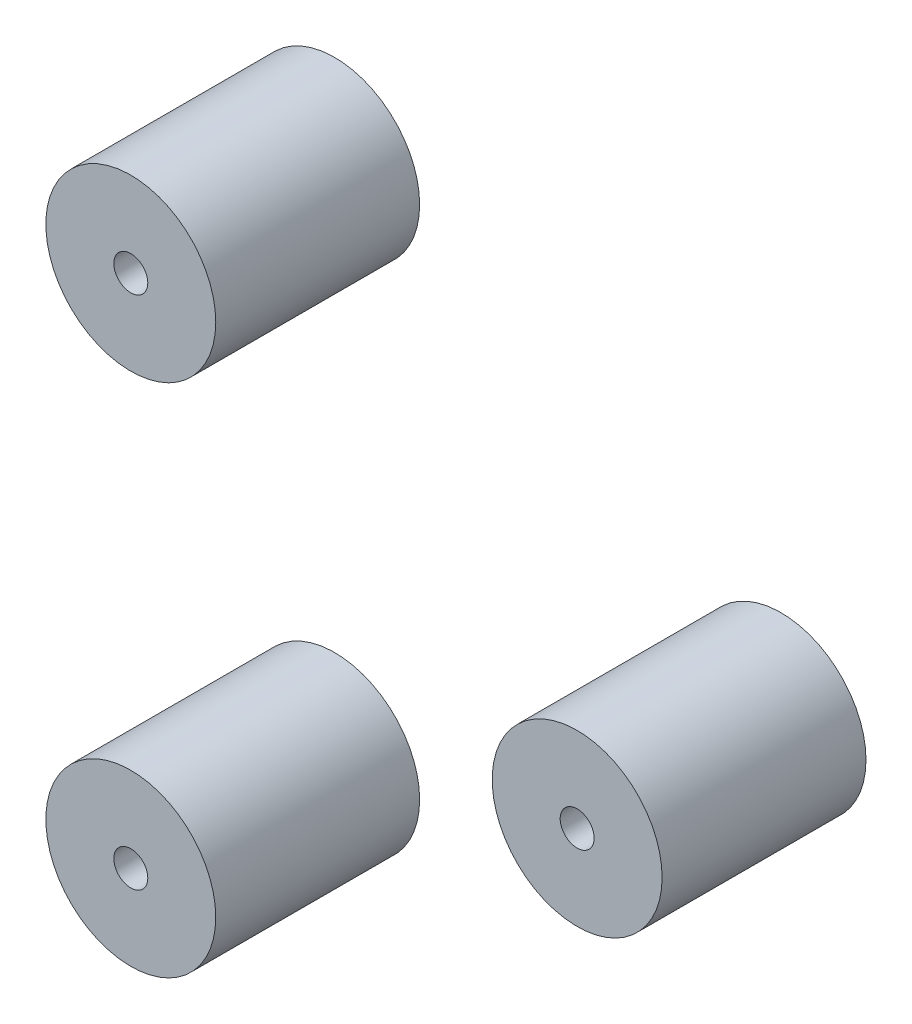
ISO-10303-21;
HEADER;
FILE_DESCRIPTION(('STEP AP214'),'2;1');
FILE_NAME('part.step','',(''),(''),'','','');
FILE_SCHEMA(('AUTOMOTIVE_DESIGN { 1 0 10303 214 1 1 1 1 }'));
ENDSEC;
DATA;
#1=APPLICATION_CONTEXT('core data for automotive mechanical design processes');
#2=APPLICATION_PROTOCOL_DEFINITION('international standard','automotive_design',2000,#1);
#3=PRODUCT_CONTEXT('',#1,'mechanical');
#4=PRODUCT('Part','Part','',(#3));
#5=PRODUCT_RELATED_PRODUCT_CATEGORY('part','',(#4));
#6=PRODUCT_DEFINITION_FORMATION('','',#4);
#7=PRODUCT_DEFINITION_CONTEXT('part definition',#1,'design');
#8=PRODUCT_DEFINITION('design','',#6,#7);
#9=PRODUCT_DEFINITION_SHAPE('','',#8);
#10=(LENGTH_UNIT() NAMED_UNIT(*) SI_UNIT(.MILLI.,.METRE.));
#11=(NAMED_UNIT(*) PLANE_ANGLE_UNIT() SI_UNIT($,.RADIAN.));
#12=(NAMED_UNIT(*) SI_UNIT($,.STERADIAN.) SOLID_ANGLE_UNIT());
#13=UNCERTAINTY_MEASURE_WITH_UNIT(LENGTH_MEASURE(1.E-05),#10,'distance_accuracy_value','');
#14=(GEOMETRIC_REPRESENTATION_CONTEXT(3) GLOBAL_UNCERTAINTY_ASSIGNED_CONTEXT((#13)) GLOBAL_UNIT_ASSIGNED_CONTEXT((#10,
#11,#12)) REPRESENTATION_CONTEXT('',''));
#15=CARTESIAN_POINT('',(0.,0.,0.));
#16=DIRECTION('',(0.,0.,1.));
#17=DIRECTION('',(1.,0.,0.));
#18=AXIS2_PLACEMENT_3D('',#15,#16,#17);
#19=CARTESIAN_POINT('',(-21.8925184366595,37.9189542379334,30.));
#20=DIRECTION('',(0.,0.,-1.));
#21=DIRECTION('',(-1.,0.,0.));
#22=AXIS2_PLACEMENT_3D('',#19,#20,#21);
#23=CYLINDRICAL_SURFACE('',#22,2.5);
#24=CARTESIAN_POINT('',(-21.8925184366595,37.9189542379334,30.));
#25=DIRECTION('',(0.,0.,1.));
#26=DIRECTION('',(1.,0.,0.));
#27=AXIS2_PLACEMENT_3D('',#24,#25,#26);
#28=CIRCLE('',#27,2.5);
#29=CARTESIAN_POINT('',(-19.3925184366595,37.9189542379334,30.));
#30=VERTEX_POINT('',#29);
#31=EDGE_CURVE('E53',#30,#30,#28,.T.);
#32=ORIENTED_EDGE('',*,*,#31,.T.);
#33=EDGE_LOOP('',(#32));
#34=FACE_BOUND('',#33,.T.);
#35=CARTESIAN_POINT('',(-21.8925184366595,37.9189542379334,25.));
#36=DIRECTION('',(0.,0.,-1.));
#37=DIRECTION('',(-1.,0.,0.));
#38=AXIS2_PLACEMENT_3D('',#35,#36,#37);
#39=CIRCLE('',#38,2.5);
#40=CARTESIAN_POINT('',(-24.3925184366595,37.9189542379334,25.));
#41=VERTEX_POINT('',#40);
#42=EDGE_CURVE('E44',#41,#41,#39,.T.);
#43=ORIENTED_EDGE('',*,*,#42,.T.);
#44=EDGE_LOOP('',(#43));
#45=FACE_BOUND('',#44,.T.);
#46=ADVANCED_FACE('F40',(#34,#45),#23,.F.);
#47=CARTESIAN_POINT('',(-21.8925184366595,37.9189542379334,30.));
#48=DIRECTION('',(0.,0.,1.));
#49=DIRECTION('',(1.,0.,0.));
#50=AXIS2_PLACEMENT_3D('',#47,#48,#49);
#51=PLANE('',#50);
#52=CARTESIAN_POINT('',(-21.8925184366595,37.9189542379334,30.));
#53=DIRECTION('',(0.,0.,1.));
#54=DIRECTION('',(1.,0.,0.));
#55=AXIS2_PLACEMENT_3D('',#52,#53,#54);
#56=CIRCLE('',#55,12.5);
#57=CARTESIAN_POINT('',(-9.39251843665948,37.9189542379334,30.));
#58=VERTEX_POINT('',#57);
#59=EDGE_CURVE('E11',#58,#58,#56,.T.);
#60=ORIENTED_EDGE('',*,*,#59,.T.);
#61=EDGE_LOOP('',(#60));
#62=FACE_BOUND('',#61,.T.);
#63=ORIENTED_EDGE('',*,*,#31,.F.);
#64=EDGE_LOOP('',(#63));
#65=FACE_BOUND('',#64,.T.);
#66=ADVANCED_FACE('F78',(#62,#65),#51,.T.);
#67=CARTESIAN_POINT('',(-21.8925184366595,37.9189542379334,0.));
#68=DIRECTION('',(0.,0.,1.));
#69=DIRECTION('',(1.,0.,0.));
#70=AXIS2_PLACEMENT_3D('',#67,#68,#69);
#71=PLANE('',#70);
#72=CARTESIAN_POINT('',(-21.8925184366595,37.9189542379334,0.));
#73=DIRECTION('',(0.,0.,-1.));
#74=DIRECTION('',(-1.,0.,0.));
#75=AXIS2_PLACEMENT_3D('',#72,#73,#74);
#76=CIRCLE('',#75,8.);
#77=CARTESIAN_POINT('',(-29.8925184366595,37.9189542379334,0.));
#78=VERTEX_POINT('',#77);
#79=EDGE_CURVE('E57',#78,#78,#76,.T.);
#80=ORIENTED_EDGE('',*,*,#79,.F.);
#81=EDGE_LOOP('',(#80));
#82=FACE_BOUND('',#81,.T.);
#83=CARTESIAN_POINT('',(-21.8925184366595,37.9189542379334,0.));
#84=DIRECTION('',(0.,0.,1.));
#85=DIRECTION('',(1.,0.,0.));
#86=AXIS2_PLACEMENT_3D('',#83,#84,#85);
#87=CIRCLE('',#86,12.5);
#88=CARTESIAN_POINT('',(-9.39251843665948,37.9189542379334,0.));
#89=VERTEX_POINT('',#88);
#90=EDGE_CURVE('E48',#89,#89,#87,.T.);
#91=ORIENTED_EDGE('',*,*,#90,.F.);
#92=EDGE_LOOP('',(#91));
#93=FACE_BOUND('',#92,.T.);
#94=ADVANCED_FACE('F84',(#82,#93),#71,.F.);
#95=CARTESIAN_POINT('',(-21.8925184366595,37.9189542379334,30.));
#96=DIRECTION('',(0.,0.,-1.));
#97=DIRECTION('',(-1.,0.,0.));
#98=AXIS2_PLACEMENT_3D('',#95,#96,#97);
#99=CYLINDRICAL_SURFACE('',#98,12.5);
#100=ORIENTED_EDGE('',*,*,#59,.F.);
#101=EDGE_LOOP('',(#100));
#102=FACE_BOUND('',#101,.T.);
#103=ORIENTED_EDGE('',*,*,#90,.T.);
#104=EDGE_LOOP('',(#103));
#105=FACE_BOUND('',#104,.T.);
#106=ADVANCED_FACE('F42',(#102,#105),#99,.T.);
#107=CARTESIAN_POINT('',(-21.8925184366595,37.9189542379334,25.));
#108=DIRECTION('',(0.,0.,-1.));
#109=DIRECTION('',(-1.,0.,0.));
#110=AXIS2_PLACEMENT_3D('',#107,#108,#109);
#111=CYLINDRICAL_SURFACE('',#110,8.);
#112=CARTESIAN_POINT('',(-21.8925184366595,37.9189542379334,25.));
#113=DIRECTION('',(0.,0.,-1.));
#114=DIRECTION('',(-1.,0.,0.));
#115=AXIS2_PLACEMENT_3D('',#112,#113,#114);
#116=CIRCLE('',#115,8.);
#117=CARTESIAN_POINT('',(-29.8925184366595,37.9189542379334,25.));
#118=VERTEX_POINT('',#117);
#119=EDGE_CURVE('E60',#118,#118,#116,.T.);
#120=ORIENTED_EDGE('',*,*,#119,.F.);
#121=EDGE_LOOP('',(#120));
#122=FACE_BOUND('',#121,.T.);
#123=ORIENTED_EDGE('',*,*,#79,.T.);
#124=EDGE_LOOP('',(#123));
#125=FACE_BOUND('',#124,.T.);
#126=ADVANCED_FACE('F70',(#122,#125),#111,.F.);
#127=CARTESIAN_POINT('',(-21.8925184366595,37.9189542379334,25.));
#128=DIRECTION('',(0.,0.,-1.));
#129=DIRECTION('',(-1.,0.,0.));
#130=AXIS2_PLACEMENT_3D('',#127,#128,#129);
#131=PLANE('',#130);
#132=ORIENTED_EDGE('',*,*,#42,.F.);
#133=EDGE_LOOP('',(#132));
#134=FACE_BOUND('',#133,.T.);
#135=ORIENTED_EDGE('',*,*,#119,.T.);
#136=EDGE_LOOP('',(#135));
#137=FACE_BOUND('',#136,.T.);
#138=ADVANCED_FACE('F68',(#134,#137),#131,.T.);
#139=CLOSED_SHELL('',(#46,#66,#94,#106,#126,#138));
#140=MANIFOLD_SOLID_BREP('B2',#139);
#141=CARTESIAN_POINT('',(-21.89251843666,-37.9189542379331,30.));
#142=DIRECTION('',(0.,0.,-1.));
#143=DIRECTION('',(-1.,0.,0.));
#144=AXIS2_PLACEMENT_3D('',#141,#142,#143);
#145=CYLINDRICAL_SURFACE('',#144,2.5);
#146=CARTESIAN_POINT('',(-21.89251843666,-37.9189542379331,30.));
#147=DIRECTION('',(0.,0.,1.));
#148=DIRECTION('',(1.,0.,0.));
#149=AXIS2_PLACEMENT_3D('',#146,#147,#148);
#150=CIRCLE('',#149,2.5);
#151=CARTESIAN_POINT('',(-19.39251843666,-37.9189542379331,30.));
#152=VERTEX_POINT('',#151);
#153=EDGE_CURVE('E152',#152,#152,#150,.T.);
#154=ORIENTED_EDGE('',*,*,#153,.T.);
#155=EDGE_LOOP('',(#154));
#156=FACE_BOUND('',#155,.T.);
#157=CARTESIAN_POINT('',(-21.89251843666,-37.9189542379331,25.));
#158=DIRECTION('',(0.,0.,-1.));
#159=DIRECTION('',(-1.,0.,0.));
#160=AXIS2_PLACEMENT_3D('',#157,#158,#159);
#161=CIRCLE('',#160,2.5);
#162=CARTESIAN_POINT('',(-24.39251843666,-37.9189542379331,25.));
#163=VERTEX_POINT('',#162);
#164=EDGE_CURVE('E143',#163,#163,#161,.T.);
#165=ORIENTED_EDGE('',*,*,#164,.T.);
#166=EDGE_LOOP('',(#165));
#167=FACE_BOUND('',#166,.T.);
#168=ADVANCED_FACE('F139',(#156,#167),#145,.F.);
#169=CARTESIAN_POINT('',(-21.89251843666,-37.9189542379331,30.));
#170=DIRECTION('',(0.,0.,1.));
#171=DIRECTION('',(1.,0.,0.));
#172=AXIS2_PLACEMENT_3D('',#169,#170,#171);
#173=PLANE('',#172);
#174=CARTESIAN_POINT('',(-21.89251843666,-37.9189542379331,30.));
#175=DIRECTION('',(0.,0.,1.));
#176=DIRECTION('',(1.,0.,0.));
#177=AXIS2_PLACEMENT_3D('',#174,#175,#176);
#178=CIRCLE('',#177,12.5);
#179=CARTESIAN_POINT('',(-9.39251843666002,-37.9189542379331,30.));
#180=VERTEX_POINT('',#179);
#181=EDGE_CURVE('E39',#180,#180,#178,.T.);
#182=ORIENTED_EDGE('',*,*,#181,.T.);
#183=EDGE_LOOP('',(#182));
#184=FACE_BOUND('',#183,.T.);
#185=ORIENTED_EDGE('',*,*,#153,.F.);
#186=EDGE_LOOP('',(#185));
#187=FACE_BOUND('',#186,.T.);
#188=ADVANCED_FACE('F177',(#184,#187),#173,.T.);
#189=CARTESIAN_POINT('',(-21.89251843666,-37.9189542379331,0.));
#190=DIRECTION('',(0.,0.,1.));
#191=DIRECTION('',(1.,0.,0.));
#192=AXIS2_PLACEMENT_3D('',#189,#190,#191);
#193=PLANE('',#192);
#194=CARTESIAN_POINT('',(-21.89251843666,-37.9189542379331,0.));
#195=DIRECTION('',(0.,0.,-1.));
#196=DIRECTION('',(-1.,0.,0.));
#197=AXIS2_PLACEMENT_3D('',#194,#195,#196);
#198=CIRCLE('',#197,8.);
#199=CARTESIAN_POINT('',(-29.89251843666,-37.9189542379331,0.));
#200=VERTEX_POINT('',#199);
#201=EDGE_CURVE('E156',#200,#200,#198,.T.);
#202=ORIENTED_EDGE('',*,*,#201,.F.);
#203=EDGE_LOOP('',(#202));
#204=FACE_BOUND('',#203,.T.);
#205=CARTESIAN_POINT('',(-21.89251843666,-37.9189542379331,0.));
#206=DIRECTION('',(0.,0.,1.));
#207=DIRECTION('',(1.,0.,0.));
#208=AXIS2_PLACEMENT_3D('',#205,#206,#207);
#209=CIRCLE('',#208,12.5);
#210=CARTESIAN_POINT('',(-9.39251843666002,-37.9189542379331,0.));
#211=VERTEX_POINT('',#210);
#212=EDGE_CURVE('E147',#211,#211,#209,.T.);
#213=ORIENTED_EDGE('',*,*,#212,.F.);
#214=EDGE_LOOP('',(#213));
#215=FACE_BOUND('',#214,.T.);
#216=ADVANCED_FACE('F183',(#204,#215),#193,.F.);
#217=CARTESIAN_POINT('',(-21.89251843666,-37.9189542379331,30.));
#218=DIRECTION('',(0.,0.,-1.));
#219=DIRECTION('',(-1.,0.,0.));
#220=AXIS2_PLACEMENT_3D('',#217,#218,#219);
#221=CYLINDRICAL_SURFACE('',#220,12.5);
#222=ORIENTED_EDGE('',*,*,#181,.F.);
#223=EDGE_LOOP('',(#222));
#224=FACE_BOUND('',#223,.T.);
#225=ORIENTED_EDGE('',*,*,#212,.T.);
#226=EDGE_LOOP('',(#225));
#227=FACE_BOUND('',#226,.T.);
#228=ADVANCED_FACE('F141',(#224,#227),#221,.T.);
#229=CARTESIAN_POINT('',(-21.89251843666,-37.9189542379331,25.));
#230=DIRECTION('',(0.,0.,-1.));
#231=DIRECTION('',(-1.,0.,0.));
#232=AXIS2_PLACEMENT_3D('',#229,#230,#231);
#233=CYLINDRICAL_SURFACE('',#232,8.);
#234=CARTESIAN_POINT('',(-21.89251843666,-37.9189542379331,25.));
#235=DIRECTION('',(0.,0.,-1.));
#236=DIRECTION('',(-1.,0.,0.));
#237=AXIS2_PLACEMENT_3D('',#234,#235,#236);
#238=CIRCLE('',#237,8.);
#239=CARTESIAN_POINT('',(-29.89251843666,-37.9189542379331,25.));
#240=VERTEX_POINT('',#239);
#241=EDGE_CURVE('E159',#240,#240,#238,.T.);
#242=ORIENTED_EDGE('',*,*,#241,.F.);
#243=EDGE_LOOP('',(#242));
#244=FACE_BOUND('',#243,.T.);
#245=ORIENTED_EDGE('',*,*,#201,.T.);
#246=EDGE_LOOP('',(#245));
#247=FACE_BOUND('',#246,.T.);
#248=ADVANCED_FACE('F169',(#244,#247),#233,.F.);
#249=CARTESIAN_POINT('',(-21.89251843666,-37.9189542379331,25.));
#250=DIRECTION('',(0.,0.,-1.));
#251=DIRECTION('',(-1.,0.,0.));
#252=AXIS2_PLACEMENT_3D('',#249,#250,#251);
#253=PLANE('',#252);
#254=ORIENTED_EDGE('',*,*,#164,.F.);
#255=EDGE_LOOP('',(#254));
#256=FACE_BOUND('',#255,.T.);
#257=ORIENTED_EDGE('',*,*,#241,.T.);
#258=EDGE_LOOP('',(#257));
#259=FACE_BOUND('',#258,.T.);
#260=ADVANCED_FACE('F167',(#256,#259),#253,.T.);
#261=CLOSED_SHELL('',(#168,#188,#216,#228,#248,#260));
#262=MANIFOLD_SOLID_BREP('B6',#261);
#263=CARTESIAN_POINT('',(43.7850368733197,0.,30.));
#264=DIRECTION('',(0.,0.,-1.));
#265=DIRECTION('',(-1.,0.,0.));
#266=AXIS2_PLACEMENT_3D('',#263,#264,#265);
#267=CYLINDRICAL_SURFACE('',#266,2.5);
#268=CARTESIAN_POINT('',(43.7850368733197,0.,30.));
#269=DIRECTION('',(0.,0.,1.));
#270=DIRECTION('',(1.,0.,0.));
#271=AXIS2_PLACEMENT_3D('',#268,#269,#270);
#272=CIRCLE('',#271,2.5);
#273=CARTESIAN_POINT('',(46.2850368733197,0.,30.));
#274=VERTEX_POINT('',#273);
#275=EDGE_CURVE('E244',#274,#274,#272,.T.);
#276=ORIENTED_EDGE('',*,*,#275,.T.);
#277=EDGE_LOOP('',(#276));
#278=FACE_BOUND('',#277,.T.);
#279=CARTESIAN_POINT('',(43.7850368733197,0.,25.));
#280=DIRECTION('',(0.,0.,-1.));
#281=DIRECTION('',(-1.,0.,0.));
#282=AXIS2_PLACEMENT_3D('',#279,#280,#281);
#283=CIRCLE('',#282,2.5);
#284=CARTESIAN_POINT('',(41.2850368733197,0.,25.));
#285=VERTEX_POINT('',#284);
#286=EDGE_CURVE('E235',#285,#285,#283,.T.);
#287=ORIENTED_EDGE('',*,*,#286,.T.);
#288=EDGE_LOOP('',(#287));
#289=FACE_BOUND('',#288,.T.);
#290=ADVANCED_FACE('F231',(#278,#289),#267,.F.);
#291=CARTESIAN_POINT('',(43.7850368733197,0.,30.));
#292=DIRECTION('',(0.,0.,1.));
#293=DIRECTION('',(1.,0.,0.));
#294=AXIS2_PLACEMENT_3D('',#291,#292,#293);
#295=PLANE('',#294);
#296=CARTESIAN_POINT('',(43.7850368733197,0.,30.));
#297=DIRECTION('',(0.,0.,1.));
#298=DIRECTION('',(1.,0.,0.));
#299=AXIS2_PLACEMENT_3D('',#296,#297,#298);
#300=CIRCLE('',#299,12.5);
#301=CARTESIAN_POINT('',(56.2850368733197,0.,30.));
#302=VERTEX_POINT('',#301);
#303=EDGE_CURVE('E138',#302,#302,#300,.T.);
#304=ORIENTED_EDGE('',*,*,#303,.T.);
#305=EDGE_LOOP('',(#304));
#306=FACE_BOUND('',#305,.T.);
#307=ORIENTED_EDGE('',*,*,#275,.F.);
#308=EDGE_LOOP('',(#307));
#309=FACE_BOUND('',#308,.T.);
#310=ADVANCED_FACE('F269',(#306,#309),#295,.T.);
#311=CARTESIAN_POINT('',(43.7850368733197,0.,0.));
#312=DIRECTION('',(0.,0.,1.));
#313=DIRECTION('',(1.,0.,0.));
#314=AXIS2_PLACEMENT_3D('',#311,#312,#313);
#315=PLANE('',#314);
#316=CARTESIAN_POINT('',(43.7850368733197,0.,0.));
#317=DIRECTION('',(0.,0.,-1.));
#318=DIRECTION('',(-1.,0.,0.));
#319=AXIS2_PLACEMENT_3D('',#316,#317,#318);
#320=CIRCLE('',#319,8.);
#321=CARTESIAN_POINT('',(35.7850368733197,0.,0.));
#322=VERTEX_POINT('',#321);
#323=EDGE_CURVE('E248',#322,#322,#320,.T.);
#324=ORIENTED_EDGE('',*,*,#323,.F.);
#325=EDGE_LOOP('',(#324));
#326=FACE_BOUND('',#325,.T.);
#327=CARTESIAN_POINT('',(43.7850368733197,0.,0.));
#328=DIRECTION('',(0.,0.,1.));
#329=DIRECTION('',(1.,0.,0.));
#330=AXIS2_PLACEMENT_3D('',#327,#328,#329);
#331=CIRCLE('',#330,12.5);
#332=CARTESIAN_POINT('',(56.2850368733197,0.,0.));
#333=VERTEX_POINT('',#332);
#334=EDGE_CURVE('E239',#333,#333,#331,.T.);
#335=ORIENTED_EDGE('',*,*,#334,.F.);
#336=EDGE_LOOP('',(#335));
#337=FACE_BOUND('',#336,.T.);
#338=ADVANCED_FACE('F275',(#326,#337),#315,.F.);
#339=CARTESIAN_POINT('',(43.7850368733197,0.,30.));
#340=DIRECTION('',(0.,0.,-1.));
#341=DIRECTION('',(-1.,0.,0.));
#342=AXIS2_PLACEMENT_3D('',#339,#340,#341);
#343=CYLINDRICAL_SURFACE('',#342,12.5);
#344=ORIENTED_EDGE('',*,*,#303,.F.);
#345=EDGE_LOOP('',(#344));
#346=FACE_BOUND('',#345,.T.);
#347=ORIENTED_EDGE('',*,*,#334,.T.);
#348=EDGE_LOOP('',(#347));
#349=FACE_BOUND('',#348,.T.);
#350=ADVANCED_FACE('F233',(#346,#349),#343,.T.);
#351=CARTESIAN_POINT('',(43.7850368733197,0.,25.));
#352=DIRECTION('',(0.,0.,-1.));
#353=DIRECTION('',(-1.,0.,0.));
#354=AXIS2_PLACEMENT_3D('',#351,#352,#353);
#355=CYLINDRICAL_SURFACE('',#354,8.);
#356=CARTESIAN_POINT('',(43.7850368733197,0.,25.));
#357=DIRECTION('',(0.,0.,-1.));
#358=DIRECTION('',(-1.,0.,0.));
#359=AXIS2_PLACEMENT_3D('',#356,#357,#358);
#360=CIRCLE('',#359,8.);
#361=CARTESIAN_POINT('',(35.7850368733197,0.,25.));
#362=VERTEX_POINT('',#361);
#363=EDGE_CURVE('E251',#362,#362,#360,.T.);
#364=ORIENTED_EDGE('',*,*,#363,.F.);
#365=EDGE_LOOP('',(#364));
#366=FACE_BOUND('',#365,.T.);
#367=ORIENTED_EDGE('',*,*,#323,.T.);
#368=EDGE_LOOP('',(#367));
#369=FACE_BOUND('',#368,.T.);
#370=ADVANCED_FACE('F261',(#366,#369),#355,.F.);
#371=CARTESIAN_POINT('',(43.7850368733197,0.,25.));
#372=DIRECTION('',(0.,0.,-1.));
#373=DIRECTION('',(-1.,0.,0.));
#374=AXIS2_PLACEMENT_3D('',#371,#372,#373);
#375=PLANE('',#374);
#376=ORIENTED_EDGE('',*,*,#286,.F.);
#377=EDGE_LOOP('',(#376));
#378=FACE_BOUND('',#377,.T.);
#379=ORIENTED_EDGE('',*,*,#363,.T.);
#380=EDGE_LOOP('',(#379));
#381=FACE_BOUND('',#380,.T.);
#382=ADVANCED_FACE('F259',(#378,#381),#375,.T.);
#383=CLOSED_SHELL('',(#290,#310,#338,#350,#370,#382));
#384=MANIFOLD_SOLID_BREP('B34',#383);
#385=ADVANCED_BREP_SHAPE_REPRESENTATION('',(#18,#140,#262,#384),#14);
#386=SHAPE_DEFINITION_REPRESENTATION(#9,#385);
ENDSEC;
END-ISO-10303-21;
